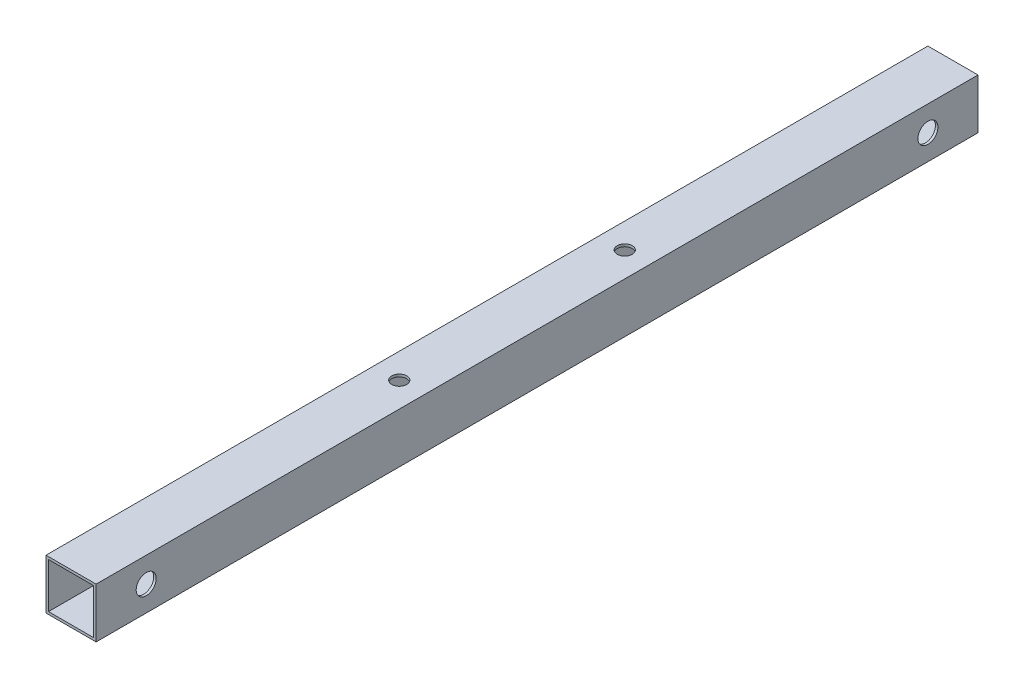
ISO-10303-21;
HEADER;
FILE_DESCRIPTION(('STEP AP214'),'2;1');
FILE_NAME('part.step','',(''),(''),'','','');
FILE_SCHEMA(('AUTOMOTIVE_DESIGN { 1 0 10303 214 1 1 1 1 }'));
ENDSEC;
DATA;
#1=APPLICATION_CONTEXT('core data for automotive mechanical design processes');
#2=APPLICATION_PROTOCOL_DEFINITION('international standard','automotive_design',2000,#1);
#3=PRODUCT_CONTEXT('',#1,'mechanical');
#4=PRODUCT('Part','Part','',(#3));
#5=PRODUCT_RELATED_PRODUCT_CATEGORY('part','',(#4));
#6=PRODUCT_DEFINITION_FORMATION('','',#4);
#7=PRODUCT_DEFINITION_CONTEXT('part definition',#1,'design');
#8=PRODUCT_DEFINITION('design','',#6,#7);
#9=PRODUCT_DEFINITION_SHAPE('','',#8);
#10=(LENGTH_UNIT() NAMED_UNIT(*) SI_UNIT(.MILLI.,.METRE.));
#11=(NAMED_UNIT(*) PLANE_ANGLE_UNIT() SI_UNIT($,.RADIAN.));
#12=(NAMED_UNIT(*) SI_UNIT($,.STERADIAN.) SOLID_ANGLE_UNIT());
#13=UNCERTAINTY_MEASURE_WITH_UNIT(LENGTH_MEASURE(1.E-05),#10,'distance_accuracy_value','');
#14=(GEOMETRIC_REPRESENTATION_CONTEXT(3) GLOBAL_UNCERTAINTY_ASSIGNED_CONTEXT((#13)) GLOBAL_UNIT_ASSIGNED_CONTEXT((#10,
#11,#12)) REPRESENTATION_CONTEXT('',''));
#15=CARTESIAN_POINT('',(0.,0.,0.));
#16=DIRECTION('',(0.,0.,1.));
#17=DIRECTION('',(1.,0.,0.));
#18=AXIS2_PLACEMENT_3D('',#15,#16,#17);
#19=CARTESIAN_POINT('',(0.,0.,176.));
#20=DIRECTION('',(0.,0.,1.));
#21=DIRECTION('',(1.,0.,0.));
#22=AXIS2_PLACEMENT_3D('',#19,#20,#21);
#23=PLANE('',#22);
#24=DIRECTION('',(0.,1.,0.));
#25=VECTOR('',#24,1.);
#26=CARTESIAN_POINT('',(5.,5.,176.));
#27=LINE('',#26,#25);
#28=CARTESIAN_POINT('',(5.,-5.,176.));
#29=VERTEX_POINT('',#28);
#30=CARTESIAN_POINT('',(5.,5.,176.));
#31=VERTEX_POINT('',#30);
#32=EDGE_CURVE('E157',#29,#31,#27,.T.);
#33=ORIENTED_EDGE('',*,*,#32,.T.);
#34=DIRECTION('',(-1.,0.,0.));
#35=VECTOR('',#34,1.);
#36=CARTESIAN_POINT('',(-5.,5.,176.));
#37=LINE('',#36,#35);
#38=CARTESIAN_POINT('',(-5.,5.,176.));
#39=VERTEX_POINT('',#38);
#40=EDGE_CURVE('E161',#31,#39,#37,.T.);
#41=ORIENTED_EDGE('',*,*,#40,.T.);
#42=DIRECTION('',(0.,-1.,0.));
#43=VECTOR('',#42,1.);
#44=CARTESIAN_POINT('',(-5.,5.,176.));
#45=LINE('',#44,#43);
#46=CARTESIAN_POINT('',(-5.,-5.,176.));
#47=VERTEX_POINT('',#46);
#48=EDGE_CURVE('E165',#39,#47,#45,.T.);
#49=ORIENTED_EDGE('',*,*,#48,.T.);
#50=DIRECTION('',(1.,0.,0.));
#51=VECTOR('',#50,1.);
#52=CARTESIAN_POINT('',(-5.,-5.,176.));
#53=LINE('',#52,#51);
#54=EDGE_CURVE('E168',#47,#29,#53,.T.);
#55=ORIENTED_EDGE('',*,*,#54,.T.);
#56=EDGE_LOOP('',(#33,#41,#49,#55));
#57=FACE_BOUND('',#56,.T.);
#58=DIRECTION('',(-1.,0.,0.));
#59=VECTOR('',#58,1.);
#60=CARTESIAN_POINT('',(-4.5,4.5,176.));
#61=LINE('',#60,#59);
#62=CARTESIAN_POINT('',(4.5,4.5,176.));
#63=VERTEX_POINT('',#62);
#64=CARTESIAN_POINT('',(-4.5,4.5,176.));
#65=VERTEX_POINT('',#64);
#66=EDGE_CURVE('E116',#63,#65,#61,.T.);
#67=ORIENTED_EDGE('',*,*,#66,.F.);
#68=DIRECTION('',(0.,1.,0.));
#69=VECTOR('',#68,1.);
#70=CARTESIAN_POINT('',(4.5,4.5,176.));
#71=LINE('',#70,#69);
#72=CARTESIAN_POINT('',(4.5,-4.5,176.));
#73=VERTEX_POINT('',#72);
#74=EDGE_CURVE('E107',#73,#63,#71,.T.);
#75=ORIENTED_EDGE('',*,*,#74,.F.);
#76=DIRECTION('',(1.,0.,0.));
#77=VECTOR('',#76,1.);
#78=CARTESIAN_POINT('',(-4.5,-4.5,176.));
#79=LINE('',#78,#77);
#80=CARTESIAN_POINT('',(-4.5,-4.5,176.));
#81=VERTEX_POINT('',#80);
#82=EDGE_CURVE('E133',#81,#73,#79,.T.);
#83=ORIENTED_EDGE('',*,*,#82,.F.);
#84=DIRECTION('',(0.,-1.,0.));
#85=VECTOR('',#84,1.);
#86=CARTESIAN_POINT('',(-4.5,4.5,176.));
#87=LINE('',#86,#85);
#88=EDGE_CURVE('E129',#65,#81,#87,.T.);
#89=ORIENTED_EDGE('',*,*,#88,.F.);
#90=EDGE_LOOP('',(#67,#75,#83,#89));
#91=FACE_BOUND('',#90,.T.);
#92=ADVANCED_FACE('F39',(#57,#91),#23,.T.);
#93=CARTESIAN_POINT('',(0.,0.,0.));
#94=DIRECTION('',(0.,0.,1.));
#95=DIRECTION('',(1.,0.,0.));
#96=AXIS2_PLACEMENT_3D('',#93,#94,#95);
#97=PLANE('',#96);
#98=DIRECTION('',(0.,1.,0.));
#99=VECTOR('',#98,1.);
#100=CARTESIAN_POINT('',(5.,5.,0.));
#101=LINE('',#100,#99);
#102=CARTESIAN_POINT('',(5.,-5.,0.));
#103=VERTEX_POINT('',#102);
#104=CARTESIAN_POINT('',(5.,5.,0.));
#105=VERTEX_POINT('',#104);
#106=EDGE_CURVE('E125',#103,#105,#101,.T.);
#107=ORIENTED_EDGE('',*,*,#106,.F.);
#108=DIRECTION('',(1.,0.,0.));
#109=VECTOR('',#108,1.);
#110=CARTESIAN_POINT('',(-5.,-5.,0.));
#111=LINE('',#110,#109);
#112=CARTESIAN_POINT('',(-5.,-5.,0.));
#113=VERTEX_POINT('',#112);
#114=EDGE_CURVE('E162',#113,#103,#111,.T.);
#115=ORIENTED_EDGE('',*,*,#114,.F.);
#116=DIRECTION('',(0.,-1.,0.));
#117=VECTOR('',#116,1.);
#118=CARTESIAN_POINT('',(-5.,5.,0.));
#119=LINE('',#118,#117);
#120=CARTESIAN_POINT('',(-5.,5.,0.));
#121=VERTEX_POINT('',#120);
#122=EDGE_CURVE('E178',#121,#113,#119,.T.);
#123=ORIENTED_EDGE('',*,*,#122,.F.);
#124=DIRECTION('',(-1.,0.,0.));
#125=VECTOR('',#124,1.);
#126=CARTESIAN_POINT('',(-5.,5.,0.));
#127=LINE('',#126,#125);
#128=EDGE_CURVE('E175',#105,#121,#127,.T.);
#129=ORIENTED_EDGE('',*,*,#128,.F.);
#130=EDGE_LOOP('',(#107,#115,#123,#129));
#131=FACE_BOUND('',#130,.T.);
#132=DIRECTION('',(0.,1.,0.));
#133=VECTOR('',#132,1.);
#134=CARTESIAN_POINT('',(4.5,4.5,0.));
#135=LINE('',#134,#133);
#136=CARTESIAN_POINT('',(4.5,-4.5,0.));
#137=VERTEX_POINT('',#136);
#138=CARTESIAN_POINT('',(4.5,4.5,0.));
#139=VERTEX_POINT('',#138);
#140=EDGE_CURVE('E65',#137,#139,#135,.T.);
#141=ORIENTED_EDGE('',*,*,#140,.T.);
#142=DIRECTION('',(-1.,0.,0.));
#143=VECTOR('',#142,1.);
#144=CARTESIAN_POINT('',(-4.5,4.5,0.));
#145=LINE('',#144,#143);
#146=CARTESIAN_POINT('',(-4.5,4.5,0.));
#147=VERTEX_POINT('',#146);
#148=EDGE_CURVE('E123',#139,#147,#145,.T.);
#149=ORIENTED_EDGE('',*,*,#148,.T.);
#150=DIRECTION('',(0.,-1.,0.));
#151=VECTOR('',#150,1.);
#152=CARTESIAN_POINT('',(-4.5,4.5,0.));
#153=LINE('',#152,#151);
#154=CARTESIAN_POINT('',(-4.5,-4.5,0.));
#155=VERTEX_POINT('',#154);
#156=EDGE_CURVE('E144',#147,#155,#153,.T.);
#157=ORIENTED_EDGE('',*,*,#156,.T.);
#158=DIRECTION('',(1.,0.,0.));
#159=VECTOR('',#158,1.);
#160=CARTESIAN_POINT('',(-4.5,-4.5,0.));
#161=LINE('',#160,#159);
#162=EDGE_CURVE('E117',#155,#137,#161,.T.);
#163=ORIENTED_EDGE('',*,*,#162,.T.);
#164=EDGE_LOOP('',(#141,#149,#157,#163));
#165=FACE_BOUND('',#164,.T.);
#166=ADVANCED_FACE('F277',(#131,#165),#97,.F.);
#167=CARTESIAN_POINT('',(5.,5.,176.));
#168=DIRECTION('',(-1.,0.,0.));
#169=DIRECTION('',(0.,0.,1.));
#170=AXIS2_PLACEMENT_3D('',#167,#168,#169);
#171=PLANE('',#170);
#172=CARTESIAN_POINT('',(5.,0.,10.));
#173=DIRECTION('',(-1.,0.,0.));
#174=DIRECTION('',(0.,0.,1.));
#175=AXIS2_PLACEMENT_3D('',#172,#173,#174);
#176=CIRCLE('',#175,2.);
#177=CARTESIAN_POINT('',(5.,0.,12.));
#178=VERTEX_POINT('',#177);
#179=EDGE_CURVE('E141',#178,#178,#176,.T.);
#180=ORIENTED_EDGE('',*,*,#179,.T.);
#181=EDGE_LOOP('',(#180));
#182=FACE_BOUND('',#181,.T.);
#183=CARTESIAN_POINT('',(5.,0.,166.));
#184=DIRECTION('',(-1.,0.,0.));
#185=DIRECTION('',(0.,0.,1.));
#186=AXIS2_PLACEMENT_3D('',#183,#184,#185);
#187=CIRCLE('',#186,2.);
#188=CARTESIAN_POINT('',(5.,0.,168.));
#189=VERTEX_POINT('',#188);
#190=EDGE_CURVE('E203',#189,#189,#187,.T.);
#191=ORIENTED_EDGE('',*,*,#190,.T.);
#192=EDGE_LOOP('',(#191));
#193=FACE_BOUND('',#192,.T.);
#194=ORIENTED_EDGE('',*,*,#106,.T.);
#195=DIRECTION('',(0.,0.,-1.));
#196=VECTOR('',#195,1.);
#197=CARTESIAN_POINT('',(5.,5.,176.));
#198=LINE('',#197,#196);
#199=EDGE_CURVE('E11',#31,#105,#198,.T.);
#200=ORIENTED_EDGE('',*,*,#199,.F.);
#201=ORIENTED_EDGE('',*,*,#32,.F.);
#202=DIRECTION('',(0.,0.,-1.));
#203=VECTOR('',#202,1.);
#204=CARTESIAN_POINT('',(5.,-5.,176.));
#205=LINE('',#204,#203);
#206=EDGE_CURVE('E171',#29,#103,#205,.T.);
#207=ORIENTED_EDGE('',*,*,#206,.T.);
#208=EDGE_LOOP('',(#194,#200,#201,#207));
#209=FACE_BOUND('',#208,.T.);
#210=ADVANCED_FACE('F41',(#182,#193,#209),#171,.F.);
#211=CARTESIAN_POINT('',(-5.,5.,176.));
#212=DIRECTION('',(0.,-1.,0.));
#213=DIRECTION('',(0.,0.,-1.));
#214=AXIS2_PLACEMENT_3D('',#211,#212,#213);
#215=PLANE('',#214);
#216=CARTESIAN_POINT('',(0.,5.,65.5));
#217=DIRECTION('',(0.,1.,0.));
#218=DIRECTION('',(0.,0.,1.));
#219=AXIS2_PLACEMENT_3D('',#216,#217,#218);
#220=CIRCLE('',#219,1.5);
#221=CARTESIAN_POINT('',(0.,5.,67.));
#222=VERTEX_POINT('',#221);
#223=EDGE_CURVE('E208',#222,#222,#220,.T.);
#224=ORIENTED_EDGE('',*,*,#223,.F.);
#225=EDGE_LOOP('',(#224));
#226=FACE_BOUND('',#225,.T.);
#227=CARTESIAN_POINT('',(0.,5.,110.5));
#228=DIRECTION('',(0.,1.,0.));
#229=DIRECTION('',(0.,0.,1.));
#230=AXIS2_PLACEMENT_3D('',#227,#228,#229);
#231=CIRCLE('',#230,1.5);
#232=CARTESIAN_POINT('',(0.,5.,112.));
#233=VERTEX_POINT('',#232);
#234=EDGE_CURVE('E217',#233,#233,#231,.T.);
#235=ORIENTED_EDGE('',*,*,#234,.F.);
#236=EDGE_LOOP('',(#235));
#237=FACE_BOUND('',#236,.T.);
#238=ORIENTED_EDGE('',*,*,#128,.T.);
#239=DIRECTION('',(0.,0.,-1.));
#240=VECTOR('',#239,1.);
#241=CARTESIAN_POINT('',(-5.,5.,176.));
#242=LINE('',#241,#240);
#243=EDGE_CURVE('E49',#39,#121,#242,.T.);
#244=ORIENTED_EDGE('',*,*,#243,.F.);
#245=ORIENTED_EDGE('',*,*,#40,.F.);
#246=ORIENTED_EDGE('',*,*,#199,.T.);
#247=EDGE_LOOP('',(#238,#244,#245,#246));
#248=FACE_BOUND('',#247,.T.);
#249=ADVANCED_FACE('F294',(#226,#237,#248),#215,.F.);
#250=CARTESIAN_POINT('',(-5.,5.,176.));
#251=DIRECTION('',(1.,0.,0.));
#252=DIRECTION('',(0.,1.,0.));
#253=AXIS2_PLACEMENT_3D('',#250,#251,#252);
#254=PLANE('',#253);
#255=CARTESIAN_POINT('',(-5.,0.,10.));
#256=DIRECTION('',(-1.,0.,0.));
#257=DIRECTION('',(0.,-1.,0.));
#258=AXIS2_PLACEMENT_3D('',#255,#256,#257);
#259=CIRCLE('',#258,2.);
#260=CARTESIAN_POINT('',(-5.,-2.,10.));
#261=VERTEX_POINT('',#260);
#262=EDGE_CURVE('E198',#261,#261,#259,.T.);
#263=ORIENTED_EDGE('',*,*,#262,.F.);
#264=EDGE_LOOP('',(#263));
#265=FACE_BOUND('',#264,.T.);
#266=CARTESIAN_POINT('',(-5.,0.,166.));
#267=DIRECTION('',(-1.,0.,0.));
#268=DIRECTION('',(0.,-1.,0.));
#269=AXIS2_PLACEMENT_3D('',#266,#267,#268);
#270=CIRCLE('',#269,2.);
#271=CARTESIAN_POINT('',(-5.,-2.,166.));
#272=VERTEX_POINT('',#271);
#273=EDGE_CURVE('E236',#272,#272,#270,.T.);
#274=ORIENTED_EDGE('',*,*,#273,.F.);
#275=EDGE_LOOP('',(#274));
#276=FACE_BOUND('',#275,.T.);
#277=ORIENTED_EDGE('',*,*,#122,.T.);
#278=DIRECTION('',(0.,0.,-1.));
#279=VECTOR('',#278,1.);
#280=CARTESIAN_POINT('',(-5.,-5.,176.));
#281=LINE('',#280,#279);
#282=EDGE_CURVE('E186',#47,#113,#281,.T.);
#283=ORIENTED_EDGE('',*,*,#282,.F.);
#284=ORIENTED_EDGE('',*,*,#48,.F.);
#285=ORIENTED_EDGE('',*,*,#243,.T.);
#286=EDGE_LOOP('',(#277,#283,#284,#285));
#287=FACE_BOUND('',#286,.T.);
#288=ADVANCED_FACE('F291',(#265,#276,#287),#254,.F.);
#289=CARTESIAN_POINT('',(-5.,-5.,176.));
#290=DIRECTION('',(0.,1.,0.));
#291=DIRECTION('',(0.,0.,1.));
#292=AXIS2_PLACEMENT_3D('',#289,#290,#291);
#293=PLANE('',#292);
#294=CARTESIAN_POINT('',(0.,-5.,65.5));
#295=DIRECTION('',(0.,1.,0.));
#296=DIRECTION('',(0.,0.,1.));
#297=AXIS2_PLACEMENT_3D('',#294,#295,#296);
#298=CIRCLE('',#297,1.5);
#299=CARTESIAN_POINT('',(0.,-5.,67.));
#300=VERTEX_POINT('',#299);
#301=EDGE_CURVE('E232',#300,#300,#298,.T.);
#302=ORIENTED_EDGE('',*,*,#301,.T.);
#303=EDGE_LOOP('',(#302));
#304=FACE_BOUND('',#303,.T.);
#305=CARTESIAN_POINT('',(0.,-5.,110.5));
#306=DIRECTION('',(0.,1.,0.));
#307=DIRECTION('',(0.,0.,1.));
#308=AXIS2_PLACEMENT_3D('',#305,#306,#307);
#309=CIRCLE('',#308,1.5);
#310=CARTESIAN_POINT('',(0.,-5.,112.));
#311=VERTEX_POINT('',#310);
#312=EDGE_CURVE('E214',#311,#311,#309,.T.);
#313=ORIENTED_EDGE('',*,*,#312,.T.);
#314=EDGE_LOOP('',(#313));
#315=FACE_BOUND('',#314,.T.);
#316=ORIENTED_EDGE('',*,*,#114,.T.);
#317=ORIENTED_EDGE('',*,*,#206,.F.);
#318=ORIENTED_EDGE('',*,*,#54,.F.);
#319=ORIENTED_EDGE('',*,*,#282,.T.);
#320=EDGE_LOOP('',(#316,#317,#318,#319));
#321=FACE_BOUND('',#320,.T.);
#322=ADVANCED_FACE('F288',(#304,#315,#321),#293,.F.);
#323=CARTESIAN_POINT('',(4.5,4.5,176.));
#324=DIRECTION('',(-1.,0.,0.));
#325=DIRECTION('',(0.,-1.,0.));
#326=AXIS2_PLACEMENT_3D('',#323,#324,#325);
#327=PLANE('',#326);
#328=CARTESIAN_POINT('',(4.5,0.,10.));
#329=DIRECTION('',(-1.,0.,0.));
#330=DIRECTION('',(0.,-1.,0.));
#331=AXIS2_PLACEMENT_3D('',#328,#329,#330);
#332=CIRCLE('',#331,2.);
#333=CARTESIAN_POINT('',(4.5,-2.,10.));
#334=VERTEX_POINT('',#333);
#335=EDGE_CURVE('E202',#334,#334,#332,.T.);
#336=ORIENTED_EDGE('',*,*,#335,.F.);
#337=EDGE_LOOP('',(#336));
#338=FACE_BOUND('',#337,.T.);
#339=CARTESIAN_POINT('',(4.5,0.,166.));
#340=DIRECTION('',(-1.,0.,0.));
#341=DIRECTION('',(0.,-1.,0.));
#342=AXIS2_PLACEMENT_3D('',#339,#340,#341);
#343=CIRCLE('',#342,2.);
#344=CARTESIAN_POINT('',(4.5,-2.,166.));
#345=VERTEX_POINT('',#344);
#346=EDGE_CURVE('E197',#345,#345,#343,.T.);
#347=ORIENTED_EDGE('',*,*,#346,.F.);
#348=EDGE_LOOP('',(#347));
#349=FACE_BOUND('',#348,.T.);
#350=ORIENTED_EDGE('',*,*,#140,.F.);
#351=DIRECTION('',(0.,0.,-1.));
#352=VECTOR('',#351,1.);
#353=CARTESIAN_POINT('',(4.5,-4.5,176.));
#354=LINE('',#353,#352);
#355=EDGE_CURVE('E111',#73,#137,#354,.T.);
#356=ORIENTED_EDGE('',*,*,#355,.F.);
#357=ORIENTED_EDGE('',*,*,#74,.T.);
#358=DIRECTION('',(0.,0.,-1.));
#359=VECTOR('',#358,1.);
#360=CARTESIAN_POINT('',(4.5,4.5,176.));
#361=LINE('',#360,#359);
#362=EDGE_CURVE('E110',#63,#139,#361,.T.);
#363=ORIENTED_EDGE('',*,*,#362,.T.);
#364=EDGE_LOOP('',(#350,#356,#357,#363));
#365=FACE_BOUND('',#364,.T.);
#366=ADVANCED_FACE('F109',(#338,#349,#365),#327,.T.);
#367=CARTESIAN_POINT('',(-4.5,4.5,176.));
#368=DIRECTION('',(0.,-1.,0.));
#369=DIRECTION('',(0.,0.,-1.));
#370=AXIS2_PLACEMENT_3D('',#367,#368,#369);
#371=PLANE('',#370);
#372=CARTESIAN_POINT('',(0.,4.5,65.5));
#373=DIRECTION('',(0.,-1.,0.));
#374=DIRECTION('',(0.,0.,-1.));
#375=AXIS2_PLACEMENT_3D('',#372,#373,#374);
#376=CIRCLE('',#375,1.5);
#377=CARTESIAN_POINT('',(0.,4.5,64.));
#378=VERTEX_POINT('',#377);
#379=EDGE_CURVE('E228',#378,#378,#376,.T.);
#380=ORIENTED_EDGE('',*,*,#379,.F.);
#381=EDGE_LOOP('',(#380));
#382=FACE_BOUND('',#381,.T.);
#383=CARTESIAN_POINT('',(0.,4.5,110.5));
#384=DIRECTION('',(0.,-1.,0.));
#385=DIRECTION('',(0.,0.,-1.));
#386=AXIS2_PLACEMENT_3D('',#383,#384,#385);
#387=CIRCLE('',#386,1.5);
#388=CARTESIAN_POINT('',(0.,4.5,109.));
#389=VERTEX_POINT('',#388);
#390=EDGE_CURVE('E207',#389,#389,#387,.T.);
#391=ORIENTED_EDGE('',*,*,#390,.F.);
#392=EDGE_LOOP('',(#391));
#393=FACE_BOUND('',#392,.T.);
#394=ORIENTED_EDGE('',*,*,#148,.F.);
#395=ORIENTED_EDGE('',*,*,#362,.F.);
#396=ORIENTED_EDGE('',*,*,#66,.T.);
#397=DIRECTION('',(0.,0.,-1.));
#398=VECTOR('',#397,1.);
#399=CARTESIAN_POINT('',(-4.5,4.5,176.));
#400=LINE('',#399,#398);
#401=EDGE_CURVE('E126',#65,#147,#400,.T.);
#402=ORIENTED_EDGE('',*,*,#401,.T.);
#403=EDGE_LOOP('',(#394,#395,#396,#402));
#404=FACE_BOUND('',#403,.T.);
#405=ADVANCED_FACE('F120',(#382,#393,#404),#371,.T.);
#406=CARTESIAN_POINT('',(-4.5,4.5,176.));
#407=DIRECTION('',(1.,0.,0.));
#408=DIRECTION('',(0.,1.,0.));
#409=AXIS2_PLACEMENT_3D('',#406,#407,#408);
#410=PLANE('',#409);
#411=CARTESIAN_POINT('',(-4.5,0.,10.));
#412=DIRECTION('',(1.,0.,0.));
#413=DIRECTION('',(0.,1.,0.));
#414=AXIS2_PLACEMENT_3D('',#411,#412,#413);
#415=CIRCLE('',#414,2.);
#416=CARTESIAN_POINT('',(-4.5,2.,10.));
#417=VERTEX_POINT('',#416);
#418=EDGE_CURVE('E199',#417,#417,#415,.T.);
#419=ORIENTED_EDGE('',*,*,#418,.F.);
#420=EDGE_LOOP('',(#419));
#421=FACE_BOUND('',#420,.T.);
#422=CARTESIAN_POINT('',(-4.5,0.,166.));
#423=DIRECTION('',(1.,0.,0.));
#424=DIRECTION('',(0.,1.,0.));
#425=AXIS2_PLACEMENT_3D('',#422,#423,#424);
#426=CIRCLE('',#425,2.);
#427=CARTESIAN_POINT('',(-4.5,2.,166.));
#428=VERTEX_POINT('',#427);
#429=EDGE_CURVE('E193',#428,#428,#426,.T.);
#430=ORIENTED_EDGE('',*,*,#429,.F.);
#431=EDGE_LOOP('',(#430));
#432=FACE_BOUND('',#431,.T.);
#433=ORIENTED_EDGE('',*,*,#156,.F.);
#434=ORIENTED_EDGE('',*,*,#401,.F.);
#435=ORIENTED_EDGE('',*,*,#88,.T.);
#436=DIRECTION('',(0.,0.,-1.));
#437=VECTOR('',#436,1.);
#438=CARTESIAN_POINT('',(-4.5,-4.5,176.));
#439=LINE('',#438,#437);
#440=EDGE_CURVE('E57',#81,#155,#439,.T.);
#441=ORIENTED_EDGE('',*,*,#440,.T.);
#442=EDGE_LOOP('',(#433,#434,#435,#441));
#443=FACE_BOUND('',#442,.T.);
#444=ADVANCED_FACE('F321',(#421,#432,#443),#410,.T.);
#445=CARTESIAN_POINT('',(-4.5,-4.5,176.));
#446=DIRECTION('',(0.,1.,0.));
#447=DIRECTION('',(0.,0.,1.));
#448=AXIS2_PLACEMENT_3D('',#445,#446,#447);
#449=PLANE('',#448);
#450=CARTESIAN_POINT('',(0.,-4.5,65.5));
#451=DIRECTION('',(0.,1.,0.));
#452=DIRECTION('',(0.,0.,1.));
#453=AXIS2_PLACEMENT_3D('',#450,#451,#452);
#454=CIRCLE('',#453,1.5);
#455=CARTESIAN_POINT('',(0.,-4.5,67.));
#456=VERTEX_POINT('',#455);
#457=EDGE_CURVE('E43',#456,#456,#454,.T.);
#458=ORIENTED_EDGE('',*,*,#457,.F.);
#459=EDGE_LOOP('',(#458));
#460=FACE_BOUND('',#459,.T.);
#461=CARTESIAN_POINT('',(0.,-4.5,110.5));
#462=DIRECTION('',(0.,1.,0.));
#463=DIRECTION('',(0.,0.,1.));
#464=AXIS2_PLACEMENT_3D('',#461,#462,#463);
#465=CIRCLE('',#464,1.5);
#466=CARTESIAN_POINT('',(0.,-4.5,112.));
#467=VERTEX_POINT('',#466);
#468=EDGE_CURVE('E204',#467,#467,#465,.T.);
#469=ORIENTED_EDGE('',*,*,#468,.F.);
#470=EDGE_LOOP('',(#469));
#471=FACE_BOUND('',#470,.T.);
#472=ORIENTED_EDGE('',*,*,#162,.F.);
#473=ORIENTED_EDGE('',*,*,#440,.F.);
#474=ORIENTED_EDGE('',*,*,#82,.T.);
#475=ORIENTED_EDGE('',*,*,#355,.T.);
#476=EDGE_LOOP('',(#472,#473,#474,#475));
#477=FACE_BOUND('',#476,.T.);
#478=ADVANCED_FACE('F319',(#460,#471,#477),#449,.T.);
#479=CARTESIAN_POINT('',(171.,0.,166.));
#480=DIRECTION('',(-1.,0.,0.));
#481=DIRECTION('',(0.,-1.,0.));
#482=AXIS2_PLACEMENT_3D('',#479,#480,#481);
#483=CYLINDRICAL_SURFACE('',#482,2.);
#484=ORIENTED_EDGE('',*,*,#429,.T.);
#485=EDGE_LOOP('',(#484));
#486=FACE_BOUND('',#485,.T.);
#487=ORIENTED_EDGE('',*,*,#273,.T.);
#488=EDGE_LOOP('',(#487));
#489=FACE_BOUND('',#488,.T.);
#490=ADVANCED_FACE('F273',(#486,#489),#483,.F.);
#491=CARTESIAN_POINT('',(171.,0.,10.));
#492=DIRECTION('',(-1.,0.,0.));
#493=DIRECTION('',(0.,-1.,0.));
#494=AXIS2_PLACEMENT_3D('',#491,#492,#493);
#495=CYLINDRICAL_SURFACE('',#494,2.);
#496=ORIENTED_EDGE('',*,*,#418,.T.);
#497=EDGE_LOOP('',(#496));
#498=FACE_BOUND('',#497,.T.);
#499=ORIENTED_EDGE('',*,*,#262,.T.);
#500=EDGE_LOOP('',(#499));
#501=FACE_BOUND('',#500,.T.);
#502=ADVANCED_FACE('F263',(#498,#501),#495,.F.);
#503=ORIENTED_EDGE('',*,*,#346,.T.);
#504=EDGE_LOOP('',(#503));
#505=FACE_BOUND('',#504,.T.);
#506=ORIENTED_EDGE('',*,*,#190,.F.);
#507=EDGE_LOOP('',(#506));
#508=FACE_BOUND('',#507,.T.);
#509=ADVANCED_FACE('F260',(#505,#508),#483,.F.);
#510=ORIENTED_EDGE('',*,*,#335,.T.);
#511=EDGE_LOOP('',(#510));
#512=FACE_BOUND('',#511,.T.);
#513=ORIENTED_EDGE('',*,*,#179,.F.);
#514=EDGE_LOOP('',(#513));
#515=FACE_BOUND('',#514,.T.);
#516=ADVANCED_FACE('F257',(#512,#515),#495,.F.);
#517=CARTESIAN_POINT('',(0.,-171.,110.5));
#518=DIRECTION('',(0.,1.,0.));
#519=DIRECTION('',(0.,0.,1.));
#520=AXIS2_PLACEMENT_3D('',#517,#518,#519);
#521=CYLINDRICAL_SURFACE('',#520,1.5);
#522=ORIENTED_EDGE('',*,*,#468,.T.);
#523=EDGE_LOOP('',(#522));
#524=FACE_BOUND('',#523,.T.);
#525=ORIENTED_EDGE('',*,*,#312,.F.);
#526=EDGE_LOOP('',(#525));
#527=FACE_BOUND('',#526,.T.);
#528=ADVANCED_FACE('F259',(#524,#527),#521,.F.);
#529=CARTESIAN_POINT('',(0.,-171.,65.5));
#530=DIRECTION('',(0.,1.,0.));
#531=DIRECTION('',(0.,0.,1.));
#532=AXIS2_PLACEMENT_3D('',#529,#530,#531);
#533=CYLINDRICAL_SURFACE('',#532,1.5);
#534=ORIENTED_EDGE('',*,*,#457,.T.);
#535=EDGE_LOOP('',(#534));
#536=FACE_BOUND('',#535,.T.);
#537=ORIENTED_EDGE('',*,*,#301,.F.);
#538=EDGE_LOOP('',(#537));
#539=FACE_BOUND('',#538,.T.);
#540=ADVANCED_FACE('F268',(#536,#539),#533,.F.);
#541=ORIENTED_EDGE('',*,*,#390,.T.);
#542=EDGE_LOOP('',(#541));
#543=FACE_BOUND('',#542,.T.);
#544=ORIENTED_EDGE('',*,*,#234,.T.);
#545=EDGE_LOOP('',(#544));
#546=FACE_BOUND('',#545,.T.);
#547=ADVANCED_FACE('F270',(#543,#546),#521,.F.);
#548=ORIENTED_EDGE('',*,*,#379,.T.);
#549=EDGE_LOOP('',(#548));
#550=FACE_BOUND('',#549,.T.);
#551=ORIENTED_EDGE('',*,*,#223,.T.);
#552=EDGE_LOOP('',(#551));
#553=FACE_BOUND('',#552,.T.);
#554=ADVANCED_FACE('F345',(#550,#553),#533,.F.);
#555=CLOSED_SHELL('',(#92,#166,#210,#249,#288,#322,#366,#405,#444,#478,#490,#502,#509,#516,#528,
#540,#547,#554));
#556=MANIFOLD_SOLID_BREP('B2',#555);
#557=ADVANCED_BREP_SHAPE_REPRESENTATION('',(#18,#556),#14);
#558=SHAPE_DEFINITION_REPRESENTATION(#9,#557);
ENDSEC;
END-ISO-10303-21;
